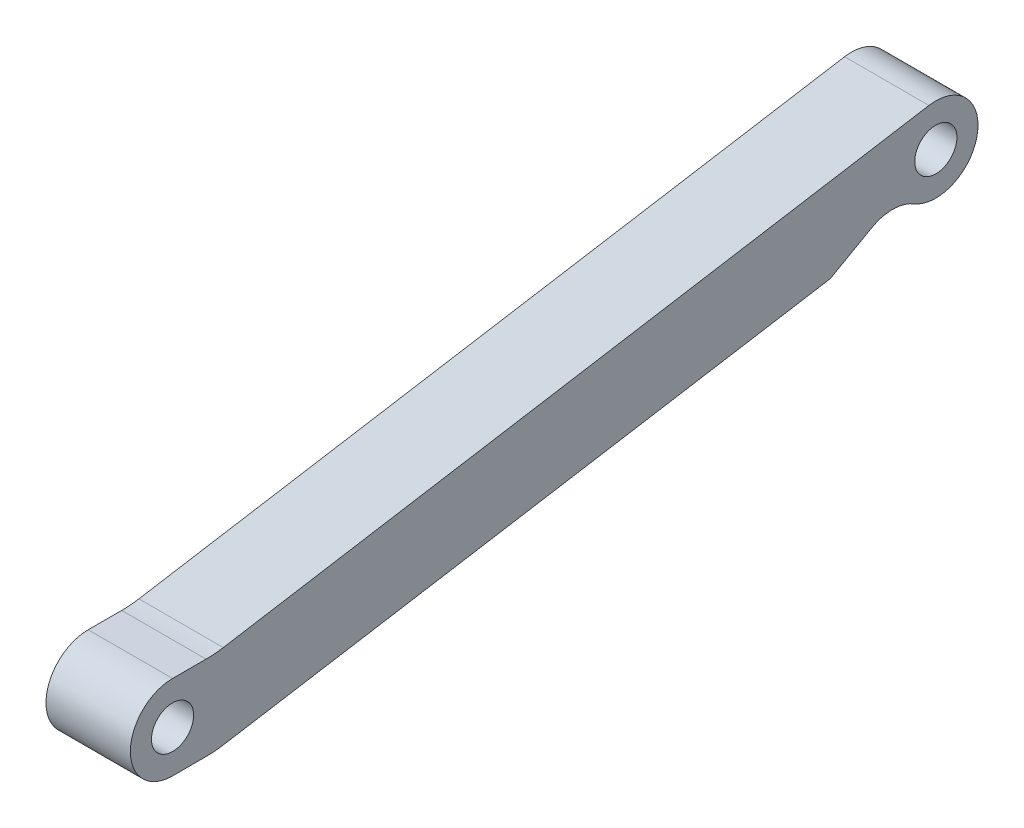
ISO-10303-21;
HEADER;
FILE_DESCRIPTION(('STEP AP214'),'2;1');
FILE_NAME('part.step','',(''),(''),'','','');
FILE_SCHEMA(('AUTOMOTIVE_DESIGN { 1 0 10303 214 1 1 1 1 }'));
ENDSEC;
DATA;
#1=APPLICATION_CONTEXT('core data for automotive mechanical design processes');
#2=APPLICATION_PROTOCOL_DEFINITION('international standard','automotive_design',2000,#1);
#3=PRODUCT_CONTEXT('',#1,'mechanical');
#4=PRODUCT('Part','Part','',(#3));
#5=PRODUCT_RELATED_PRODUCT_CATEGORY('part','',(#4));
#6=PRODUCT_DEFINITION_FORMATION('','',#4);
#7=PRODUCT_DEFINITION_CONTEXT('part definition',#1,'design');
#8=PRODUCT_DEFINITION('design','',#6,#7);
#9=PRODUCT_DEFINITION_SHAPE('','',#8);
#10=(LENGTH_UNIT() NAMED_UNIT(*) SI_UNIT(.MILLI.,.METRE.));
#11=(NAMED_UNIT(*) PLANE_ANGLE_UNIT() SI_UNIT($,.RADIAN.));
#12=(NAMED_UNIT(*) SI_UNIT($,.STERADIAN.) SOLID_ANGLE_UNIT());
#13=UNCERTAINTY_MEASURE_WITH_UNIT(LENGTH_MEASURE(1.E-05),#10,'distance_accuracy_value','');
#14=(GEOMETRIC_REPRESENTATION_CONTEXT(3) GLOBAL_UNCERTAINTY_ASSIGNED_CONTEXT((#13)) GLOBAL_UNIT_ASSIGNED_CONTEXT((#10,
#11,#12)) REPRESENTATION_CONTEXT('',''));
#15=CARTESIAN_POINT('',(0.,0.,0.));
#16=DIRECTION('',(0.,0.,1.));
#17=DIRECTION('',(1.,0.,0.));
#18=AXIS2_PLACEMENT_3D('',#15,#16,#17);
#19=CARTESIAN_POINT('',(-2.,-1.80909511990576,-87.6928692256493));
#20=DIRECTION('',(1.,0.,0.));
#21=DIRECTION('',(0.,0.,-1.));
#22=AXIS2_PLACEMENT_3D('',#19,#20,#21);
#23=CYLINDRICAL_SURFACE('',#22,2.);
#24=DIRECTION('',(1.,0.,0.));
#25=VECTOR('',#24,1.);
#26=CARTESIAN_POINT('',(-2.,-0.0920475599528996,-88.7184167266749));
#27=LINE('',#26,#25);
#28=CARTESIAN_POINT('',(-2.,-0.0920475599528996,-88.7184167266749));
#29=VERTEX_POINT('',#28);
#30=CARTESIAN_POINT('',(2.,-0.0920475599528996,-88.7184167266749));
#31=VERTEX_POINT('',#30);
#32=EDGE_CURVE('E43',#29,#31,#27,.T.);
#33=ORIENTED_EDGE('',*,*,#32,.T.);
#34=CARTESIAN_POINT('',(2.,-1.80909511990576,-87.6928692256493));
#35=DIRECTION('',(1.,0.,0.));
#36=DIRECTION('',(0.,0.,-1.));
#37=AXIS2_PLACEMENT_3D('',#34,#35,#36);
#38=CIRCLE('',#37,2.);
#39=CARTESIAN_POINT('',(2.,-0.0664660695616909,-86.7114192814866));
#40=VERTEX_POINT('',#39);
#41=EDGE_CURVE('E120',#31,#40,#38,.T.);
#42=ORIENTED_EDGE('',*,*,#41,.T.);
#43=DIRECTION('',(1.,0.,0.));
#44=VECTOR('',#43,1.);
#45=CARTESIAN_POINT('',(-2.,-0.0664660695616909,-86.7114192814866));
#46=LINE('',#45,#44);
#47=CARTESIAN_POINT('',(-2.,-0.0664660695616909,-86.7114192814866));
#48=VERTEX_POINT('',#47);
#49=EDGE_CURVE('E11',#48,#40,#46,.T.);
#50=ORIENTED_EDGE('',*,*,#49,.F.);
#51=CARTESIAN_POINT('',(-2.,-1.80909511990576,-87.6928692256493));
#52=DIRECTION('',(1.,0.,0.));
#53=DIRECTION('',(0.,0.,-1.));
#54=AXIS2_PLACEMENT_3D('',#51,#52,#53);
#55=CIRCLE('',#54,2.);
#56=EDGE_CURVE('E56',#29,#48,#55,.T.);
#57=ORIENTED_EDGE('',*,*,#56,.F.);
#58=EDGE_LOOP('',(#33,#42,#50,#57));
#59=FACE_BOUND('',#58,.T.);
#60=ADVANCED_FACE('F39',(#59),#23,.F.);
#61=CARTESIAN_POINT('',(-2.,-37.1261644339657,-20.9094827172176));
#62=DIRECTION('',(0.,-0.871314525172031,-0.490724972081346));
#63=DIRECTION('',(0.,0.490724972081346,-0.871314525172032));
#64=AXIS2_PLACEMENT_3D('',#61,#62,#63);
#65=PLANE('',#64);
#66=ORIENTED_EDGE('',*,*,#49,.T.);
#67=DIRECTION('',(0.,0.490724972081346,-0.871314525172031));
#68=VECTOR('',#67,1.);
#69=CARTESIAN_POINT('',(2.,-37.1261644339657,-20.9094827172176));
#70=LINE('',#69,#68);
#71=CARTESIAN_POINT('',(2.,-1.17453818181052,-84.7439642277006));
#72=VERTEX_POINT('',#71);
#73=EDGE_CURVE('E137',#72,#40,#70,.T.);
#74=ORIENTED_EDGE('',*,*,#73,.F.);
#75=DIRECTION('',(1.,0.,0.));
#76=VECTOR('',#75,1.);
#77=CARTESIAN_POINT('',(-2.,-1.17453818181052,-84.7439642277006));
#78=LINE('',#77,#76);
#79=CARTESIAN_POINT('',(-2.,-1.17453818181052,-84.7439642277006));
#80=VERTEX_POINT('',#79);
#81=EDGE_CURVE('E48',#80,#72,#78,.T.);
#82=ORIENTED_EDGE('',*,*,#81,.F.);
#83=DIRECTION('',(0.,0.490724972081346,-0.871314525172031));
#84=VECTOR('',#83,1.);
#85=CARTESIAN_POINT('',(-2.,-37.1261644339657,-20.9094827172176));
#86=LINE('',#85,#84);
#87=EDGE_CURVE('E124',#80,#48,#86,.T.);
#88=ORIENTED_EDGE('',*,*,#87,.T.);
#89=EDGE_LOOP('',(#66,#74,#82,#88));
#90=FACE_BOUND('',#89,.T.);
#91=ADVANCED_FACE('F232',(#90),#65,.T.);
#92=CARTESIAN_POINT('',(-2.,-14.7818581411023,-2.44400451746295));
#93=DIRECTION('',(0.,-0.986605654972482,-0.163123516319136));
#94=DIRECTION('',(0.,0.163123516319136,-0.986605654972482));
#95=AXIS2_PLACEMENT_3D('',#92,#93,#94);
#96=PLANE('',#95);
#97=ORIENTED_EDGE('',*,*,#81,.T.);
#98=DIRECTION('',(0.,0.163123516319136,-0.986605654972482));
#99=VECTOR('',#98,1.);
#100=CARTESIAN_POINT('',(2.,-14.7818581411023,-2.44400451746295));
#101=LINE('',#100,#99);
#102=CARTESIAN_POINT('',(2.,-5.93302827486242,-55.96360600056));
#103=VERTEX_POINT('',#102);
#104=EDGE_CURVE('E161',#103,#72,#101,.T.);
#105=ORIENTED_EDGE('',*,*,#104,.F.);
#106=DIRECTION('',(1.,0.,0.));
#107=VECTOR('',#106,1.);
#108=CARTESIAN_POINT('',(-2.,-5.93302827486242,-55.96360600056));
#109=LINE('',#108,#107);
#110=CARTESIAN_POINT('',(-2.,-5.93302827486242,-55.96360600056));
#111=VERTEX_POINT('',#110);
#112=EDGE_CURVE('E192',#111,#103,#109,.T.);
#113=ORIENTED_EDGE('',*,*,#112,.F.);
#114=DIRECTION('',(0.,0.163123516319136,-0.986605654972482));
#115=VECTOR('',#114,1.);
#116=CARTESIAN_POINT('',(-2.,-14.7818581411023,-2.44400451746295));
#117=LINE('',#116,#115);
#118=EDGE_CURVE('E188',#111,#80,#117,.T.);
#119=ORIENTED_EDGE('',*,*,#118,.T.);
#120=EDGE_LOOP('',(#97,#105,#113,#119));
#121=FACE_BOUND('',#120,.T.);
#122=ADVANCED_FACE('F230',(#121),#96,.T.);
#123=CARTESIAN_POINT('',(-2.,-1.00000000000001,-55.1479884189643));
#124=DIRECTION('',(1.,0.,0.));
#125=DIRECTION('',(0.,0.,-1.));
#126=AXIS2_PLACEMENT_3D('',#123,#124,#125);
#127=CYLINDRICAL_SURFACE('',#126,5.);
#128=ORIENTED_EDGE('',*,*,#112,.T.);
#129=CARTESIAN_POINT('',(2.,-1.00000000000001,-55.1479884189643));
#130=DIRECTION('',(1.,0.,0.));
#131=DIRECTION('',(0.,0.,-1.));
#132=AXIS2_PLACEMENT_3D('',#129,#130,#131);
#133=CIRCLE('',#132,5.);
#134=CARTESIAN_POINT('',(2.,-6.00000000000001,-55.1479884189643));
#135=VERTEX_POINT('',#134);
#136=EDGE_CURVE('E158',#135,#103,#133,.T.);
#137=ORIENTED_EDGE('',*,*,#136,.F.);
#138=DIRECTION('',(1.,0.,0.));
#139=VECTOR('',#138,1.);
#140=CARTESIAN_POINT('',(-2.,-6.00000000000001,-55.1479884189643));
#141=LINE('',#140,#139);
#142=CARTESIAN_POINT('',(-2.,-6.00000000000001,-55.1479884189643));
#143=VERTEX_POINT('',#142);
#144=EDGE_CURVE('E194',#143,#135,#141,.T.);
#145=ORIENTED_EDGE('',*,*,#144,.F.);
#146=CARTESIAN_POINT('',(-2.,-1.00000000000001,-55.1479884189643));
#147=DIRECTION('',(1.,0.,0.));
#148=DIRECTION('',(0.,0.,-1.));
#149=AXIS2_PLACEMENT_3D('',#146,#147,#148);
#150=CIRCLE('',#149,5.);
#151=EDGE_CURVE('E185',#143,#111,#150,.T.);
#152=ORIENTED_EDGE('',*,*,#151,.T.);
#153=EDGE_LOOP('',(#128,#137,#145,#152));
#154=FACE_BOUND('',#153,.T.);
#155=ADVANCED_FACE('F227',(#154),#127,.T.);
#156=CARTESIAN_POINT('',(-2.,-6.00000000000006,0.));
#157=DIRECTION('',(0.,-1.,0.));
#158=DIRECTION('',(0.,0.,-1.));
#159=AXIS2_PLACEMENT_3D('',#156,#157,#158);
#160=PLANE('',#159);
#161=ORIENTED_EDGE('',*,*,#144,.T.);
#162=DIRECTION('',(0.,0.,-1.));
#163=VECTOR('',#162,1.);
#164=CARTESIAN_POINT('',(2.,-6.00000000000006,0.));
#165=LINE('',#164,#163);
#166=CARTESIAN_POINT('',(2.,-6.00000000000001,-53.5585467899999));
#167=VERTEX_POINT('',#166);
#168=EDGE_CURVE('E155',#167,#135,#165,.T.);
#169=ORIENTED_EDGE('',*,*,#168,.F.);
#170=DIRECTION('',(1.,0.,0.));
#171=VECTOR('',#170,1.);
#172=CARTESIAN_POINT('',(-2.,-6.00000000000001,-53.5585467899999));
#173=LINE('',#172,#171);
#174=CARTESIAN_POINT('',(-2.,-6.00000000000001,-53.5585467899999));
#175=VERTEX_POINT('',#174);
#176=EDGE_CURVE('E196',#175,#167,#173,.T.);
#177=ORIENTED_EDGE('',*,*,#176,.F.);
#178=DIRECTION('',(0.,0.,-1.));
#179=VECTOR('',#178,1.);
#180=CARTESIAN_POINT('',(-2.,-6.00000000000006,0.));
#181=LINE('',#180,#179);
#182=EDGE_CURVE('E182',#175,#143,#181,.T.);
#183=ORIENTED_EDGE('',*,*,#182,.T.);
#184=EDGE_LOOP('',(#161,#169,#177,#183));
#185=FACE_BOUND('',#184,.T.);
#186=ADVANCED_FACE('F223',(#185),#160,.T.);
#187=CARTESIAN_POINT('',(-2.,-4.00000000000001,-53.5585467899999));
#188=DIRECTION('',(1.,0.,0.));
#189=DIRECTION('',(0.,0.,-1.));
#190=AXIS2_PLACEMENT_3D('',#187,#188,#189);
#191=CYLINDRICAL_SURFACE('',#190,2.);
#192=ORIENTED_EDGE('',*,*,#176,.T.);
#193=CARTESIAN_POINT('',(2.,-4.00000000000001,-53.5585467899999));
#194=DIRECTION('',(1.,0.,0.));
#195=DIRECTION('',(0.,0.,-1.));
#196=AXIS2_PLACEMENT_3D('',#193,#194,#195);
#197=CIRCLE('',#196,2.);
#198=CARTESIAN_POINT('',(2.,-2.00000000000001,-53.5585467899999));
#199=VERTEX_POINT('',#198);
#200=EDGE_CURVE('E152',#199,#167,#197,.T.);
#201=ORIENTED_EDGE('',*,*,#200,.F.);
#202=DIRECTION('',(1.,0.,0.));
#203=VECTOR('',#202,1.);
#204=CARTESIAN_POINT('',(-2.,-2.00000000000001,-53.5585467899999));
#205=LINE('',#204,#203);
#206=CARTESIAN_POINT('',(-2.,-2.00000000000001,-53.5585467899999));
#207=VERTEX_POINT('',#206);
#208=EDGE_CURVE('E198',#207,#199,#205,.T.);
#209=ORIENTED_EDGE('',*,*,#208,.F.);
#210=CARTESIAN_POINT('',(-2.,-4.00000000000001,-53.5585467899999));
#211=DIRECTION('',(1.,0.,0.));
#212=DIRECTION('',(0.,0.,-1.));
#213=AXIS2_PLACEMENT_3D('',#210,#211,#212);
#214=CIRCLE('',#213,2.);
#215=EDGE_CURVE('E179',#207,#175,#214,.T.);
#216=ORIENTED_EDGE('',*,*,#215,.T.);
#217=EDGE_LOOP('',(#192,#201,#209,#216));
#218=FACE_BOUND('',#217,.T.);
#219=ADVANCED_FACE('F220',(#218),#191,.T.);
#220=CARTESIAN_POINT('',(-2.,-1.99999999999998,0.));
#221=DIRECTION('',(0.,-1.,0.));
#222=DIRECTION('',(0.,0.,-1.));
#223=AXIS2_PLACEMENT_3D('',#220,#221,#222);
#224=PLANE('',#223);
#225=ORIENTED_EDGE('',*,*,#208,.T.);
#226=DIRECTION('',(0.,0.,-1.));
#227=VECTOR('',#226,1.);
#228=CARTESIAN_POINT('',(2.,-1.99999999999998,0.));
#229=LINE('',#228,#227);
#230=CARTESIAN_POINT('',(2.,-2.00000000000001,-55.1479884189643));
#231=VERTEX_POINT('',#230);
#232=EDGE_CURVE('E149',#199,#231,#229,.T.);
#233=ORIENTED_EDGE('',*,*,#232,.T.);
#234=DIRECTION('',(1.,0.,0.));
#235=VECTOR('',#234,1.);
#236=CARTESIAN_POINT('',(-2.,-2.00000000000001,-55.1479884189643));
#237=LINE('',#236,#235);
#238=CARTESIAN_POINT('',(-2.,-2.00000000000001,-55.1479884189643));
#239=VERTEX_POINT('',#238);
#240=EDGE_CURVE('E200',#239,#231,#237,.T.);
#241=ORIENTED_EDGE('',*,*,#240,.F.);
#242=DIRECTION('',(0.,0.,-1.));
#243=VECTOR('',#242,1.);
#244=CARTESIAN_POINT('',(-2.,-1.99999999999998,0.));
#245=LINE('',#244,#243);
#246=EDGE_CURVE('E177',#207,#239,#245,.T.);
#247=ORIENTED_EDGE('',*,*,#246,.F.);
#248=EDGE_LOOP('',(#225,#233,#241,#247));
#249=FACE_BOUND('',#248,.T.);
#250=ADVANCED_FACE('F215',(#249),#224,.F.);
#251=CARTESIAN_POINT('',(-2.,2.99999999999999,-55.1479884189643));
#252=DIRECTION('',(1.,0.,0.));
#253=DIRECTION('',(0.,0.,-1.));
#254=AXIS2_PLACEMENT_3D('',#251,#252,#253);
#255=CYLINDRICAL_SURFACE('',#254,5.);
#256=ORIENTED_EDGE('',*,*,#240,.T.);
#257=CARTESIAN_POINT('',(2.,2.99999999999999,-55.1479884189643));
#258=DIRECTION('',(1.,0.,0.));
#259=DIRECTION('',(0.,0.,-1.));
#260=AXIS2_PLACEMENT_3D('',#257,#258,#259);
#261=CIRCLE('',#260,5.);
#262=CARTESIAN_POINT('',(2.,-1.93302827486242,-55.96360600056));
#263=VERTEX_POINT('',#262);
#264=EDGE_CURVE('E146',#231,#263,#261,.T.);
#265=ORIENTED_EDGE('',*,*,#264,.T.);
#266=DIRECTION('',(1.,0.,0.));
#267=VECTOR('',#266,1.);
#268=CARTESIAN_POINT('',(-2.,-1.93302827486242,-55.96360600056));
#269=LINE('',#268,#267);
#270=CARTESIAN_POINT('',(-2.,-1.93302827486242,-55.96360600056));
#271=VERTEX_POINT('',#270);
#272=EDGE_CURVE('E202',#271,#263,#269,.T.);
#273=ORIENTED_EDGE('',*,*,#272,.F.);
#274=CARTESIAN_POINT('',(-2.,2.99999999999999,-55.1479884189643));
#275=DIRECTION('',(1.,0.,0.));
#276=DIRECTION('',(0.,0.,-1.));
#277=AXIS2_PLACEMENT_3D('',#274,#275,#276);
#278=CIRCLE('',#277,5.);
#279=EDGE_CURVE('E175',#239,#271,#278,.T.);
#280=ORIENTED_EDGE('',*,*,#279,.F.);
#281=EDGE_LOOP('',(#256,#265,#273,#280));
#282=FACE_BOUND('',#281,.T.);
#283=ADVANCED_FACE('F211',(#282),#255,.F.);
#284=CARTESIAN_POINT('',(-2.,-10.8882952674075,-1.80025018282513));
#285=DIRECTION('',(0.,-0.986605654972482,-0.163123516319136));
#286=DIRECTION('',(0.,0.163123516319136,-0.986605654972482));
#287=AXIS2_PLACEMENT_3D('',#284,#285,#286);
#288=PLANE('',#287);
#289=ORIENTED_EDGE('',*,*,#272,.T.);
#290=DIRECTION('',(0.,0.163123516319136,-0.986605654972482));
#291=VECTOR('',#290,1.);
#292=CARTESIAN_POINT('',(2.,-10.8882952674075,-1.80025018282513));
#293=LINE('',#292,#291);
#294=CARTESIAN_POINT('',(2.,3.59821130994492,-89.4177171950623));
#295=VERTEX_POINT('',#294);
#296=EDGE_CURVE('E132',#263,#295,#293,.T.);
#297=ORIENTED_EDGE('',*,*,#296,.T.);
#298=DIRECTION('',(1.,0.,0.));
#299=VECTOR('',#298,1.);
#300=CARTESIAN_POINT('',(-2.,3.59821130994492,-89.4177171950623));
#301=LINE('',#300,#299);
#302=CARTESIAN_POINT('',(-2.,3.59821130994492,-89.4177171950623));
#303=VERTEX_POINT('',#302);
#304=EDGE_CURVE('E123',#303,#295,#301,.T.);
#305=ORIENTED_EDGE('',*,*,#304,.F.);
#306=DIRECTION('',(0.,0.163123516319136,-0.986605654972482));
#307=VECTOR('',#306,1.);
#308=CARTESIAN_POINT('',(-2.,-10.8882952674075,-1.80025018282513));
#309=LINE('',#308,#307);
#310=EDGE_CURVE('E173',#271,#303,#309,.T.);
#311=ORIENTED_EDGE('',*,*,#310,.F.);
#312=EDGE_LOOP('',(#289,#297,#305,#311));
#313=FACE_BOUND('',#312,.T.);
#314=ADVANCED_FACE('F206',(#313),#288,.F.);
#315=CARTESIAN_POINT('',(-2.,1.62499999999996,-89.7439642277005));
#316=DIRECTION('',(1.,0.,0.));
#317=DIRECTION('',(0.,0.,-1.));
#318=AXIS2_PLACEMENT_3D('',#315,#316,#317);
#319=CYLINDRICAL_SURFACE('',#318,1.00000000000001);
#320=CARTESIAN_POINT('',(-2.,1.62499999999996,-89.7439642277005));
#321=DIRECTION('',(1.,0.,0.));
#322=DIRECTION('',(0.,0.,-1.));
#323=AXIS2_PLACEMENT_3D('',#320,#321,#322);
#324=CIRCLE('',#323,1.00000000000001);
#325=CARTESIAN_POINT('',(-2.,1.62499999999996,-90.7439642277006));
#326=VERTEX_POINT('',#325);
#327=EDGE_CURVE('E167',#326,#326,#324,.T.);
#328=ORIENTED_EDGE('',*,*,#327,.F.);
#329=EDGE_LOOP('',(#328));
#330=FACE_BOUND('',#329,.T.);
#331=CARTESIAN_POINT('',(2.,1.62499999999996,-89.7439642277005));
#332=DIRECTION('',(1.,0.,0.));
#333=DIRECTION('',(0.,0.,-1.));
#334=AXIS2_PLACEMENT_3D('',#331,#332,#333);
#335=CIRCLE('',#334,1.00000000000001);
#336=CARTESIAN_POINT('',(2.,1.62499999999996,-90.7439642277006));
#337=VERTEX_POINT('',#336);
#338=EDGE_CURVE('E138',#337,#337,#335,.T.);
#339=ORIENTED_EDGE('',*,*,#338,.T.);
#340=EDGE_LOOP('',(#339));
#341=FACE_BOUND('',#340,.T.);
#342=ADVANCED_FACE('F252',(#330,#341),#319,.F.);
#343=CARTESIAN_POINT('',(-2.,-4.00000000000001,-53.5585467899999));
#344=DIRECTION('',(1.,0.,0.));
#345=DIRECTION('',(0.,0.,-1.));
#346=AXIS2_PLACEMENT_3D('',#343,#344,#345);
#347=CYLINDRICAL_SURFACE('',#346,1.00000000000001);
#348=CARTESIAN_POINT('',(-2.,-4.00000000000001,-53.5585467899999));
#349=DIRECTION('',(1.,0.,0.));
#350=DIRECTION('',(0.,0.,-1.));
#351=AXIS2_PLACEMENT_3D('',#348,#349,#350);
#352=CIRCLE('',#351,1.00000000000001);
#353=CARTESIAN_POINT('',(-2.,-4.00000000000001,-54.55854679));
#354=VERTEX_POINT('',#353);
#355=EDGE_CURVE('E164',#354,#354,#352,.T.);
#356=ORIENTED_EDGE('',*,*,#355,.F.);
#357=EDGE_LOOP('',(#356));
#358=FACE_BOUND('',#357,.T.);
#359=CARTESIAN_POINT('',(2.,-4.00000000000001,-53.5585467899999));
#360=DIRECTION('',(1.,0.,0.));
#361=DIRECTION('',(0.,0.,-1.));
#362=AXIS2_PLACEMENT_3D('',#359,#360,#361);
#363=CIRCLE('',#362,1.00000000000001);
#364=CARTESIAN_POINT('',(2.,-4.00000000000001,-54.55854679));
#365=VERTEX_POINT('',#364);
#366=EDGE_CURVE('E141',#365,#365,#363,.T.);
#367=ORIENTED_EDGE('',*,*,#366,.T.);
#368=EDGE_LOOP('',(#367));
#369=FACE_BOUND('',#368,.T.);
#370=ADVANCED_FACE('F41',(#358,#369),#347,.F.);
#371=CARTESIAN_POINT('',(-2.,1.62499999999996,-89.7439642277005));
#372=DIRECTION('',(1.,0.,0.));
#373=DIRECTION('',(0.,0.,-1.));
#374=AXIS2_PLACEMENT_3D('',#371,#372,#373);
#375=CYLINDRICAL_SURFACE('',#374,2.);
#376=ORIENTED_EDGE('',*,*,#304,.T.);
#377=CARTESIAN_POINT('',(2.,1.62499999999996,-89.7439642277005));
#378=DIRECTION('',(1.,0.,0.));
#379=DIRECTION('',(0.,0.,-1.));
#380=AXIS2_PLACEMENT_3D('',#377,#378,#379);
#381=CIRCLE('',#380,2.);
#382=EDGE_CURVE('E126',#31,#295,#381,.T.);
#383=ORIENTED_EDGE('',*,*,#382,.F.);
#384=ORIENTED_EDGE('',*,*,#32,.F.);
#385=CARTESIAN_POINT('',(-2.,1.62499999999996,-89.7439642277005));
#386=DIRECTION('',(1.,0.,0.));
#387=DIRECTION('',(0.,0.,-1.));
#388=AXIS2_PLACEMENT_3D('',#385,#386,#387);
#389=CIRCLE('',#388,2.);
#390=EDGE_CURVE('E171',#29,#303,#389,.T.);
#391=ORIENTED_EDGE('',*,*,#390,.T.);
#392=EDGE_LOOP('',(#376,#383,#384,#391));
#393=FACE_BOUND('',#392,.T.);
#394=ADVANCED_FACE('F127',(#393),#375,.T.);
#395=CARTESIAN_POINT('',(-2.,0.,0.));
#396=DIRECTION('',(1.,0.,0.));
#397=DIRECTION('',(0.,0.,-1.));
#398=AXIS2_PLACEMENT_3D('',#395,#396,#397);
#399=PLANE('',#398);
#400=ORIENTED_EDGE('',*,*,#355,.T.);
#401=EDGE_LOOP('',(#400));
#402=FACE_BOUND('',#401,.T.);
#403=ORIENTED_EDGE('',*,*,#327,.T.);
#404=EDGE_LOOP('',(#403));
#405=FACE_BOUND('',#404,.T.);
#406=ORIENTED_EDGE('',*,*,#56,.T.);
#407=ORIENTED_EDGE('',*,*,#87,.F.);
#408=ORIENTED_EDGE('',*,*,#118,.F.);
#409=ORIENTED_EDGE('',*,*,#151,.F.);
#410=ORIENTED_EDGE('',*,*,#182,.F.);
#411=ORIENTED_EDGE('',*,*,#215,.F.);
#412=ORIENTED_EDGE('',*,*,#246,.T.);
#413=ORIENTED_EDGE('',*,*,#279,.T.);
#414=ORIENTED_EDGE('',*,*,#310,.T.);
#415=ORIENTED_EDGE('',*,*,#390,.F.);
#416=EDGE_LOOP('',(#406,#407,#408,#409,#410,#411,#412,#413,#414,#415));
#417=FACE_BOUND('',#416,.T.);
#418=ADVANCED_FACE('F233',(#402,#405,#417),#399,.F.);
#419=CARTESIAN_POINT('',(2.,0.,0.));
#420=DIRECTION('',(1.,0.,0.));
#421=DIRECTION('',(0.,0.,-1.));
#422=AXIS2_PLACEMENT_3D('',#419,#420,#421);
#423=PLANE('',#422);
#424=ORIENTED_EDGE('',*,*,#366,.F.);
#425=EDGE_LOOP('',(#424));
#426=FACE_BOUND('',#425,.T.);
#427=ORIENTED_EDGE('',*,*,#338,.F.);
#428=EDGE_LOOP('',(#427));
#429=FACE_BOUND('',#428,.T.);
#430=ORIENTED_EDGE('',*,*,#41,.F.);
#431=ORIENTED_EDGE('',*,*,#382,.T.);
#432=ORIENTED_EDGE('',*,*,#296,.F.);
#433=ORIENTED_EDGE('',*,*,#264,.F.);
#434=ORIENTED_EDGE('',*,*,#232,.F.);
#435=ORIENTED_EDGE('',*,*,#200,.T.);
#436=ORIENTED_EDGE('',*,*,#168,.T.);
#437=ORIENTED_EDGE('',*,*,#136,.T.);
#438=ORIENTED_EDGE('',*,*,#104,.T.);
#439=ORIENTED_EDGE('',*,*,#73,.T.);
#440=EDGE_LOOP('',(#430,#431,#432,#433,#434,#435,#436,#437,#438,#439));
#441=FACE_BOUND('',#440,.T.);
#442=ADVANCED_FACE('F135',(#426,#429,#441),#423,.T.);
#443=CLOSED_SHELL('',(#60,#91,#122,#155,#186,#219,#250,#283,#314,#342,#370,#394,#418,#442));
#444=MANIFOLD_SOLID_BREP('B2',#443);
#445=ADVANCED_BREP_SHAPE_REPRESENTATION('',(#18,#444),#14);
#446=SHAPE_DEFINITION_REPRESENTATION(#9,#445);
ENDSEC;
END-ISO-10303-21;
